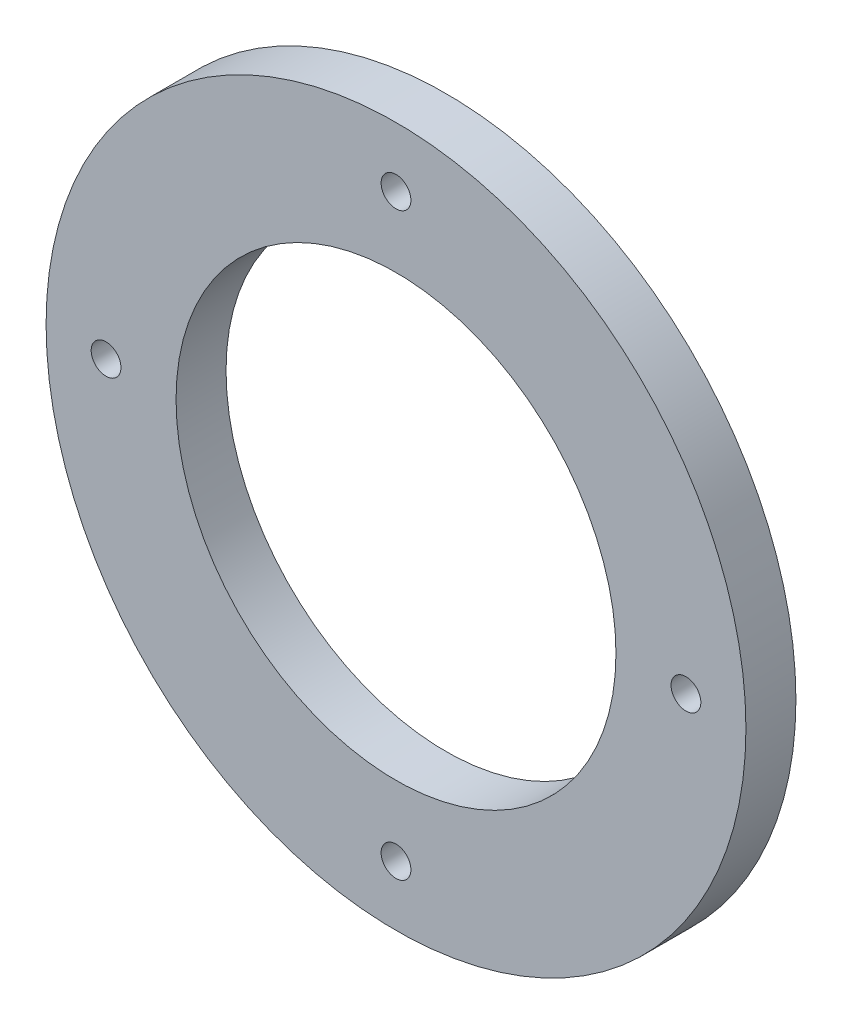
ISO-10303-21;
HEADER;
FILE_DESCRIPTION(('STEP AP214'),'2;1');
FILE_NAME('part.step','',(''),(''),'','','');
FILE_SCHEMA(('AUTOMOTIVE_DESIGN { 1 0 10303 214 1 1 1 1 }'));
ENDSEC;
DATA;
#1=APPLICATION_CONTEXT('core data for automotive mechanical design processes');
#2=APPLICATION_PROTOCOL_DEFINITION('international standard','automotive_design',2000,#1);
#3=PRODUCT_CONTEXT('',#1,'mechanical');
#4=PRODUCT('Part','Part','',(#3));
#5=PRODUCT_RELATED_PRODUCT_CATEGORY('part','',(#4));
#6=PRODUCT_DEFINITION_FORMATION('','',#4);
#7=PRODUCT_DEFINITION_CONTEXT('part definition',#1,'design');
#8=PRODUCT_DEFINITION('design','',#6,#7);
#9=PRODUCT_DEFINITION_SHAPE('','',#8);
#10=(LENGTH_UNIT() NAMED_UNIT(*) SI_UNIT(.MILLI.,.METRE.));
#11=(NAMED_UNIT(*) PLANE_ANGLE_UNIT() SI_UNIT($,.RADIAN.));
#12=(NAMED_UNIT(*) SI_UNIT($,.STERADIAN.) SOLID_ANGLE_UNIT());
#13=UNCERTAINTY_MEASURE_WITH_UNIT(LENGTH_MEASURE(1.E-05),#10,'distance_accuracy_value','');
#14=(GEOMETRIC_REPRESENTATION_CONTEXT(3) GLOBAL_UNCERTAINTY_ASSIGNED_CONTEXT((#13)) GLOBAL_UNIT_ASSIGNED_CONTEXT((#10,
#11,#12)) REPRESENTATION_CONTEXT('',''));
#15=CARTESIAN_POINT('',(0.,0.,0.));
#16=DIRECTION('',(0.,0.,1.));
#17=DIRECTION('',(1.,0.,0.));
#18=AXIS2_PLACEMENT_3D('',#15,#16,#17);
#19=CARTESIAN_POINT('',(0.,0.,5.));
#20=DIRECTION('',(0.,0.,1.));
#21=DIRECTION('',(1.,0.,0.));
#22=AXIS2_PLACEMENT_3D('',#19,#20,#21);
#23=PLANE('',#22);
#24=CARTESIAN_POINT('',(-29.,0.,5.));
#25=DIRECTION('',(0.,0.,1.));
#26=DIRECTION('',(1.,0.,0.));
#27=AXIS2_PLACEMENT_3D('',#24,#25,#26);
#28=CIRCLE('',#27,1.49);
#29=CARTESIAN_POINT('',(-27.51,0.,5.));
#30=VERTEX_POINT('',#29);
#31=EDGE_CURVE('E59',#30,#30,#28,.T.);
#32=ORIENTED_EDGE('',*,*,#31,.F.);
#33=EDGE_LOOP('',(#32));
#34=FACE_BOUND('',#33,.T.);
#35=CARTESIAN_POINT('',(29.,0.,5.));
#36=DIRECTION('',(0.,0.,1.));
#37=DIRECTION('',(1.,0.,0.));
#38=AXIS2_PLACEMENT_3D('',#35,#36,#37);
#39=CIRCLE('',#38,1.49);
#40=CARTESIAN_POINT('',(30.49,0.,5.));
#41=VERTEX_POINT('',#40);
#42=EDGE_CURVE('E47',#41,#41,#39,.T.);
#43=ORIENTED_EDGE('',*,*,#42,.F.);
#44=EDGE_LOOP('',(#43));
#45=FACE_BOUND('',#44,.T.);
#46=CARTESIAN_POINT('',(0.,0.,5.));
#47=DIRECTION('',(0.,0.,1.));
#48=DIRECTION('',(1.,0.,0.));
#49=AXIS2_PLACEMENT_3D('',#46,#47,#48);
#50=CIRCLE('',#49,35.);
#51=CARTESIAN_POINT('',(35.,0.,5.));
#52=VERTEX_POINT('',#51);
#53=EDGE_CURVE('E10',#52,#52,#50,.T.);
#54=ORIENTED_EDGE('',*,*,#53,.T.);
#55=EDGE_LOOP('',(#54));
#56=FACE_BOUND('',#55,.T.);
#57=CARTESIAN_POINT('',(0.,0.,5.));
#58=DIRECTION('',(0.,0.,1.));
#59=DIRECTION('',(1.,0.,0.));
#60=AXIS2_PLACEMENT_3D('',#57,#58,#59);
#61=CIRCLE('',#60,22.);
#62=CARTESIAN_POINT('',(22.,0.,5.));
#63=VERTEX_POINT('',#62);
#64=EDGE_CURVE('E42',#63,#63,#61,.T.);
#65=ORIENTED_EDGE('',*,*,#64,.F.);
#66=EDGE_LOOP('',(#65));
#67=FACE_BOUND('',#66,.T.);
#68=CARTESIAN_POINT('',(0.,29.,5.));
#69=DIRECTION('',(0.,0.,1.));
#70=DIRECTION('',(1.,0.,0.));
#71=AXIS2_PLACEMENT_3D('',#68,#69,#70);
#72=CIRCLE('',#71,1.49);
#73=CARTESIAN_POINT('',(1.49,29.,5.));
#74=VERTEX_POINT('',#73);
#75=EDGE_CURVE('E53',#74,#74,#72,.T.);
#76=ORIENTED_EDGE('',*,*,#75,.F.);
#77=EDGE_LOOP('',(#76));
#78=FACE_BOUND('',#77,.T.);
#79=CARTESIAN_POINT('',(0.,-29.,5.));
#80=DIRECTION('',(0.,0.,1.));
#81=DIRECTION('',(1.,0.,0.));
#82=AXIS2_PLACEMENT_3D('',#79,#80,#81);
#83=CIRCLE('',#82,1.49);
#84=CARTESIAN_POINT('',(1.49,-29.,5.));
#85=VERTEX_POINT('',#84);
#86=EDGE_CURVE('E65',#85,#85,#83,.T.);
#87=ORIENTED_EDGE('',*,*,#86,.F.);
#88=EDGE_LOOP('',(#87));
#89=FACE_BOUND('',#88,.T.);
#90=ADVANCED_FACE('F31',(#34,#45,#56,#67,#78,#89),#23,.T.);
#91=CARTESIAN_POINT('',(0.,0.,0.));
#92=DIRECTION('',(0.,0.,1.));
#93=DIRECTION('',(1.,0.,0.));
#94=AXIS2_PLACEMENT_3D('',#91,#92,#93);
#95=PLANE('',#94);
#96=CARTESIAN_POINT('',(0.,0.,0.));
#97=DIRECTION('',(0.,0.,1.));
#98=DIRECTION('',(1.,0.,0.));
#99=AXIS2_PLACEMENT_3D('',#96,#97,#98);
#100=CIRCLE('',#99,35.);
#101=CARTESIAN_POINT('',(35.,0.,0.));
#102=VERTEX_POINT('',#101);
#103=EDGE_CURVE('E35',#102,#102,#100,.T.);
#104=ORIENTED_EDGE('',*,*,#103,.F.);
#105=EDGE_LOOP('',(#104));
#106=FACE_BOUND('',#105,.T.);
#107=CARTESIAN_POINT('',(0.,0.,0.));
#108=DIRECTION('',(0.,0.,1.));
#109=DIRECTION('',(1.,0.,0.));
#110=AXIS2_PLACEMENT_3D('',#107,#108,#109);
#111=CIRCLE('',#110,22.);
#112=CARTESIAN_POINT('',(22.,0.,0.));
#113=VERTEX_POINT('',#112);
#114=EDGE_CURVE('E44',#113,#113,#111,.T.);
#115=ORIENTED_EDGE('',*,*,#114,.T.);
#116=EDGE_LOOP('',(#115));
#117=FACE_BOUND('',#116,.T.);
#118=CARTESIAN_POINT('',(29.,0.,0.));
#119=DIRECTION('',(0.,0.,1.));
#120=DIRECTION('',(1.,0.,0.));
#121=AXIS2_PLACEMENT_3D('',#118,#119,#120);
#122=CIRCLE('',#121,1.49);
#123=CARTESIAN_POINT('',(30.49,0.,0.));
#124=VERTEX_POINT('',#123);
#125=EDGE_CURVE('E50',#124,#124,#122,.T.);
#126=ORIENTED_EDGE('',*,*,#125,.T.);
#127=EDGE_LOOP('',(#126));
#128=FACE_BOUND('',#127,.T.);
#129=CARTESIAN_POINT('',(0.,29.,0.));
#130=DIRECTION('',(0.,0.,1.));
#131=DIRECTION('',(1.,0.,0.));
#132=AXIS2_PLACEMENT_3D('',#129,#130,#131);
#133=CIRCLE('',#132,1.49);
#134=CARTESIAN_POINT('',(1.49,29.,0.));
#135=VERTEX_POINT('',#134);
#136=EDGE_CURVE('E56',#135,#135,#133,.T.);
#137=ORIENTED_EDGE('',*,*,#136,.T.);
#138=EDGE_LOOP('',(#137));
#139=FACE_BOUND('',#138,.T.);
#140=CARTESIAN_POINT('',(-29.,0.,0.));
#141=DIRECTION('',(0.,0.,1.));
#142=DIRECTION('',(1.,0.,0.));
#143=AXIS2_PLACEMENT_3D('',#140,#141,#142);
#144=CIRCLE('',#143,1.49);
#145=CARTESIAN_POINT('',(-27.51,0.,0.));
#146=VERTEX_POINT('',#145);
#147=EDGE_CURVE('E62',#146,#146,#144,.T.);
#148=ORIENTED_EDGE('',*,*,#147,.T.);
#149=EDGE_LOOP('',(#148));
#150=FACE_BOUND('',#149,.T.);
#151=CARTESIAN_POINT('',(0.,-29.,0.));
#152=DIRECTION('',(0.,0.,1.));
#153=DIRECTION('',(1.,0.,0.));
#154=AXIS2_PLACEMENT_3D('',#151,#152,#153);
#155=CIRCLE('',#154,1.49);
#156=CARTESIAN_POINT('',(1.49,-29.,0.));
#157=VERTEX_POINT('',#156);
#158=EDGE_CURVE('E68',#157,#157,#155,.T.);
#159=ORIENTED_EDGE('',*,*,#158,.T.);
#160=EDGE_LOOP('',(#159));
#161=FACE_BOUND('',#160,.T.);
#162=ADVANCED_FACE('F78',(#106,#117,#128,#139,#150,#161),#95,.F.);
#163=CARTESIAN_POINT('',(0.,0.,5.));
#164=DIRECTION('',(0.,0.,-1.));
#165=DIRECTION('',(-1.,0.,0.));
#166=AXIS2_PLACEMENT_3D('',#163,#164,#165);
#167=CYLINDRICAL_SURFACE('',#166,35.);
#168=ORIENTED_EDGE('',*,*,#53,.F.);
#169=EDGE_LOOP('',(#168));
#170=FACE_BOUND('',#169,.T.);
#171=ORIENTED_EDGE('',*,*,#103,.T.);
#172=EDGE_LOOP('',(#171));
#173=FACE_BOUND('',#172,.T.);
#174=ADVANCED_FACE('F33',(#170,#173),#167,.T.);
#175=CARTESIAN_POINT('',(0.,0.,5.));
#176=DIRECTION('',(0.,0.,-1.));
#177=DIRECTION('',(-1.,0.,0.));
#178=AXIS2_PLACEMENT_3D('',#175,#176,#177);
#179=CYLINDRICAL_SURFACE('',#178,22.);
#180=ORIENTED_EDGE('',*,*,#64,.T.);
#181=EDGE_LOOP('',(#180));
#182=FACE_BOUND('',#181,.T.);
#183=ORIENTED_EDGE('',*,*,#114,.F.);
#184=EDGE_LOOP('',(#183));
#185=FACE_BOUND('',#184,.T.);
#186=ADVANCED_FACE('F88',(#182,#185),#179,.F.);
#187=CARTESIAN_POINT('',(29.,0.,5.));
#188=DIRECTION('',(0.,0.,-1.));
#189=DIRECTION('',(-1.,0.,0.));
#190=AXIS2_PLACEMENT_3D('',#187,#188,#189);
#191=CYLINDRICAL_SURFACE('',#190,1.49);
#192=ORIENTED_EDGE('',*,*,#42,.T.);
#193=EDGE_LOOP('',(#192));
#194=FACE_BOUND('',#193,.T.);
#195=ORIENTED_EDGE('',*,*,#125,.F.);
#196=EDGE_LOOP('',(#195));
#197=FACE_BOUND('',#196,.T.);
#198=ADVANCED_FACE('F91',(#194,#197),#191,.F.);
#199=CARTESIAN_POINT('',(0.,29.,5.));
#200=DIRECTION('',(0.,0.,-1.));
#201=DIRECTION('',(-1.,0.,0.));
#202=AXIS2_PLACEMENT_3D('',#199,#200,#201);
#203=CYLINDRICAL_SURFACE('',#202,1.49);
#204=ORIENTED_EDGE('',*,*,#75,.T.);
#205=EDGE_LOOP('',(#204));
#206=FACE_BOUND('',#205,.T.);
#207=ORIENTED_EDGE('',*,*,#136,.F.);
#208=EDGE_LOOP('',(#207));
#209=FACE_BOUND('',#208,.T.);
#210=ADVANCED_FACE('F95',(#206,#209),#203,.F.);
#211=CARTESIAN_POINT('',(-29.,0.,5.));
#212=DIRECTION('',(0.,0.,-1.));
#213=DIRECTION('',(-1.,0.,0.));
#214=AXIS2_PLACEMENT_3D('',#211,#212,#213);
#215=CYLINDRICAL_SURFACE('',#214,1.49);
#216=ORIENTED_EDGE('',*,*,#31,.T.);
#217=EDGE_LOOP('',(#216));
#218=FACE_BOUND('',#217,.T.);
#219=ORIENTED_EDGE('',*,*,#147,.F.);
#220=EDGE_LOOP('',(#219));
#221=FACE_BOUND('',#220,.T.);
#222=ADVANCED_FACE('F99',(#218,#221),#215,.F.);
#223=CARTESIAN_POINT('',(0.,-29.,5.));
#224=DIRECTION('',(0.,0.,-1.));
#225=DIRECTION('',(-1.,0.,0.));
#226=AXIS2_PLACEMENT_3D('',#223,#224,#225);
#227=CYLINDRICAL_SURFACE('',#226,1.49);
#228=ORIENTED_EDGE('',*,*,#86,.T.);
#229=EDGE_LOOP('',(#228));
#230=FACE_BOUND('',#229,.T.);
#231=ORIENTED_EDGE('',*,*,#158,.F.);
#232=EDGE_LOOP('',(#231));
#233=FACE_BOUND('',#232,.T.);
#234=ADVANCED_FACE('F74',(#230,#233),#227,.F.);
#235=CLOSED_SHELL('',(#90,#162,#174,#186,#198,#210,#222,#234));
#236=MANIFOLD_SOLID_BREP('B2',#235);
#237=ADVANCED_BREP_SHAPE_REPRESENTATION('',(#18,#236),#14);
#238=SHAPE_DEFINITION_REPRESENTATION(#9,#237);
ENDSEC;
END-ISO-10303-21;
